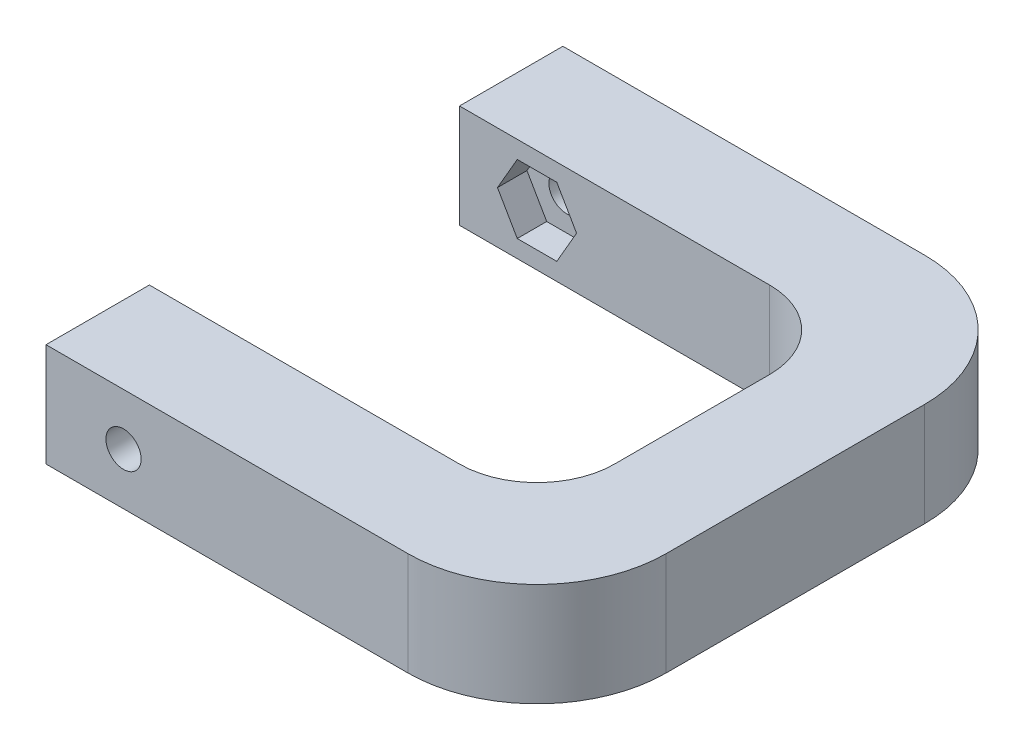
ISO-10303-21;
HEADER;
FILE_DESCRIPTION(('STEP AP214'),'2;1');
FILE_NAME('part.step','',(''),(''),'','','');
FILE_SCHEMA(('AUTOMOTIVE_DESIGN { 1 0 10303 214 1 1 1 1 }'));
ENDSEC;
DATA;
#1=APPLICATION_CONTEXT('core data for automotive mechanical design processes');
#2=APPLICATION_PROTOCOL_DEFINITION('international standard','automotive_design',2000,#1);
#3=PRODUCT_CONTEXT('',#1,'mechanical');
#4=PRODUCT('Part','Part','',(#3));
#5=PRODUCT_RELATED_PRODUCT_CATEGORY('part','',(#4));
#6=PRODUCT_DEFINITION_FORMATION('','',#4);
#7=PRODUCT_DEFINITION_CONTEXT('part definition',#1,'design');
#8=PRODUCT_DEFINITION('design','',#6,#7);
#9=PRODUCT_DEFINITION_SHAPE('','',#8);
#10=(LENGTH_UNIT() NAMED_UNIT(*) SI_UNIT(.MILLI.,.METRE.));
#11=(NAMED_UNIT(*) PLANE_ANGLE_UNIT() SI_UNIT($,.RADIAN.));
#12=(NAMED_UNIT(*) SI_UNIT($,.STERADIAN.) SOLID_ANGLE_UNIT());
#13=UNCERTAINTY_MEASURE_WITH_UNIT(LENGTH_MEASURE(1.E-05),#10,'distance_accuracy_value','');
#14=(GEOMETRIC_REPRESENTATION_CONTEXT(3) GLOBAL_UNCERTAINTY_ASSIGNED_CONTEXT((#13)) GLOBAL_UNIT_ASSIGNED_CONTEXT((#10,
#11,#12)) REPRESENTATION_CONTEXT('',''));
#15=CARTESIAN_POINT('',(0.,0.,0.));
#16=DIRECTION('',(0.,0.,1.));
#17=DIRECTION('',(1.,0.,0.));
#18=AXIS2_PLACEMENT_3D('',#15,#16,#17);
#19=CARTESIAN_POINT('',(-80.,10.,-100.));
#20=DIRECTION('',(0.,0.,1.));
#21=DIRECTION('',(1.,0.,0.));
#22=AXIS2_PLACEMENT_3D('',#19,#20,#21);
#23=CYLINDRICAL_SURFACE('',#22,3.4);
#24=CARTESIAN_POINT('',(-80.,10.,0.));
#25=DIRECTION('',(0.,0.,1.));
#26=DIRECTION('',(1.,0.,0.));
#27=AXIS2_PLACEMENT_3D('',#24,#25,#26);
#28=CIRCLE('',#27,3.4);
#29=CARTESIAN_POINT('',(-76.6,10.,0.));
#30=VERTEX_POINT('',#29);
#31=EDGE_CURVE('E308',#30,#30,#28,.T.);
#32=ORIENTED_EDGE('',*,*,#31,.T.);
#33=EDGE_LOOP('',(#32));
#34=FACE_BOUND('',#33,.T.);
#35=CARTESIAN_POINT('',(-80.,10.,-14.3));
#36=DIRECTION('',(0.,0.,-1.));
#37=DIRECTION('',(-1.,0.,0.));
#38=AXIS2_PLACEMENT_3D('',#35,#36,#37);
#39=CIRCLE('',#38,3.4);
#40=CARTESIAN_POINT('',(-83.4,10.,-14.3));
#41=VERTEX_POINT('',#40);
#42=EDGE_CURVE('E251',#41,#41,#39,.F.);
#43=ORIENTED_EDGE('',*,*,#42,.F.);
#44=EDGE_LOOP('',(#43));
#45=FACE_BOUND('',#44,.T.);
#46=ADVANCED_FACE('F35',(#34,#45),#23,.F.);
#47=CARTESIAN_POINT('',(-80.,10.,-100.));
#48=DIRECTION('',(0.,0.,1.));
#49=DIRECTION('',(1.,0.,0.));
#50=AXIS2_PLACEMENT_3D('',#47,#48,#49);
#51=CIRCLE('',#50,3.4);
#52=CARTESIAN_POINT('',(-76.6,10.,-100.));
#53=VERTEX_POINT('',#52);
#54=EDGE_CURVE('E311',#53,#53,#51,.T.);
#55=ORIENTED_EDGE('',*,*,#54,.F.);
#56=EDGE_LOOP('',(#55));
#57=FACE_BOUND('',#56,.T.);
#58=CARTESIAN_POINT('',(-80.,10.,-85.7));
#59=DIRECTION('',(0.,0.,1.));
#60=DIRECTION('',(1.,0.,0.));
#61=AXIS2_PLACEMENT_3D('',#58,#59,#60);
#62=CIRCLE('',#61,3.4);
#63=CARTESIAN_POINT('',(-76.6,10.,-85.7));
#64=VERTEX_POINT('',#63);
#65=EDGE_CURVE('E297',#64,#64,#62,.F.);
#66=ORIENTED_EDGE('',*,*,#65,.F.);
#67=EDGE_LOOP('',(#66));
#68=FACE_BOUND('',#67,.T.);
#69=ADVANCED_FACE('F453',(#57,#68),#23,.F.);
#70=CARTESIAN_POINT('',(-95.,20.,0.));
#71=DIRECTION('',(0.,0.,-1.));
#72=DIRECTION('',(-1.,0.,0.));
#73=AXIS2_PLACEMENT_3D('',#70,#71,#72);
#74=PLANE('',#73);
#75=ORIENTED_EDGE('',*,*,#31,.F.);
#76=EDGE_LOOP('',(#75));
#77=FACE_BOUND('',#76,.T.);
#78=DIRECTION('',(1.,0.,0.));
#79=VECTOR('',#78,1.);
#80=CARTESIAN_POINT('',(-95.,0.,0.));
#81=LINE('',#80,#79);
#82=CARTESIAN_POINT('',(-95.,0.,0.));
#83=VERTEX_POINT('',#82);
#84=CARTESIAN_POINT('',(-25.,0.,0.));
#85=VERTEX_POINT('',#84);
#86=EDGE_CURVE('E314',#83,#85,#81,.T.);
#87=ORIENTED_EDGE('',*,*,#86,.T.);
#88=DIRECTION('',(0.,-1.,0.));
#89=VECTOR('',#88,1.);
#90=CARTESIAN_POINT('',(-25.,20.,0.));
#91=LINE('',#90,#89);
#92=CARTESIAN_POINT('',(-25.,20.,0.));
#93=VERTEX_POINT('',#92);
#94=EDGE_CURVE('E58',#85,#93,#91,.F.);
#95=ORIENTED_EDGE('',*,*,#94,.T.);
#96=DIRECTION('',(1.,0.,0.));
#97=VECTOR('',#96,1.);
#98=CARTESIAN_POINT('',(-95.,20.,0.));
#99=LINE('',#98,#97);
#100=CARTESIAN_POINT('',(-95.,20.,0.));
#101=VERTEX_POINT('',#100);
#102=EDGE_CURVE('E315',#101,#93,#99,.T.);
#103=ORIENTED_EDGE('',*,*,#102,.F.);
#104=DIRECTION('',(0.,-1.,0.));
#105=VECTOR('',#104,1.);
#106=CARTESIAN_POINT('',(-95.,20.,0.));
#107=LINE('',#106,#105);
#108=EDGE_CURVE('E334',#101,#83,#107,.T.);
#109=ORIENTED_EDGE('',*,*,#108,.T.);
#110=EDGE_LOOP('',(#87,#95,#103,#109));
#111=FACE_BOUND('',#110,.T.);
#112=ADVANCED_FACE('F409',(#77,#111),#74,.F.);
#113=CARTESIAN_POINT('',(0.,20.,0.));
#114=DIRECTION('',(-1.,0.,0.));
#115=DIRECTION('',(0.,0.,1.));
#116=AXIS2_PLACEMENT_3D('',#113,#114,#115);
#117=PLANE('',#116);
#118=DIRECTION('',(0.,0.,-1.));
#119=VECTOR('',#118,1.);
#120=CARTESIAN_POINT('',(0.,20.,0.));
#121=LINE('',#120,#119);
#122=CARTESIAN_POINT('',(0.,20.,-25.));
#123=VERTEX_POINT('',#122);
#124=CARTESIAN_POINT('',(0.,20.,-75.));
#125=VERTEX_POINT('',#124);
#126=EDGE_CURVE('E317',#123,#125,#121,.T.);
#127=ORIENTED_EDGE('',*,*,#126,.F.);
#128=DIRECTION('',(0.,-1.,0.));
#129=VECTOR('',#128,1.);
#130=CARTESIAN_POINT('',(0.,20.,-25.));
#131=LINE('',#130,#129);
#132=CARTESIAN_POINT('',(0.,0.,-25.));
#133=VERTEX_POINT('',#132);
#134=EDGE_CURVE('E387',#123,#133,#131,.T.);
#135=ORIENTED_EDGE('',*,*,#134,.T.);
#136=DIRECTION('',(0.,0.,-1.));
#137=VECTOR('',#136,1.);
#138=CARTESIAN_POINT('',(0.,0.,0.));
#139=LINE('',#138,#137);
#140=CARTESIAN_POINT('',(0.,0.,-75.));
#141=VERTEX_POINT('',#140);
#142=EDGE_CURVE('E336',#133,#141,#139,.T.);
#143=ORIENTED_EDGE('',*,*,#142,.T.);
#144=DIRECTION('',(0.,-1.,0.));
#145=VECTOR('',#144,1.);
#146=CARTESIAN_POINT('',(0.,20.,-75.));
#147=LINE('',#146,#145);
#148=EDGE_CURVE('E385',#141,#125,#147,.F.);
#149=ORIENTED_EDGE('',*,*,#148,.T.);
#150=EDGE_LOOP('',(#127,#135,#143,#149));
#151=FACE_BOUND('',#150,.T.);
#152=ADVANCED_FACE('F401',(#151),#117,.F.);
#153=CARTESIAN_POINT('',(-95.,20.,-100.));
#154=DIRECTION('',(0.,0.,1.));
#155=DIRECTION('',(1.,0.,0.));
#156=AXIS2_PLACEMENT_3D('',#153,#154,#155);
#157=PLANE('',#156);
#158=ORIENTED_EDGE('',*,*,#54,.T.);
#159=EDGE_LOOP('',(#158));
#160=FACE_BOUND('',#159,.T.);
#161=DIRECTION('',(-1.,0.,0.));
#162=VECTOR('',#161,1.);
#163=CARTESIAN_POINT('',(-95.,20.,-100.));
#164=LINE('',#163,#162);
#165=CARTESIAN_POINT('',(-25.,20.,-100.));
#166=VERTEX_POINT('',#165);
#167=CARTESIAN_POINT('',(-95.,20.,-100.));
#168=VERTEX_POINT('',#167);
#169=EDGE_CURVE('E320',#166,#168,#164,.T.);
#170=ORIENTED_EDGE('',*,*,#169,.F.);
#171=DIRECTION('',(0.,-1.,0.));
#172=VECTOR('',#171,1.);
#173=CARTESIAN_POINT('',(-25.,20.,-100.));
#174=LINE('',#173,#172);
#175=CARTESIAN_POINT('',(-25.,0.,-100.));
#176=VERTEX_POINT('',#175);
#177=EDGE_CURVE('E11',#166,#176,#174,.T.);
#178=ORIENTED_EDGE('',*,*,#177,.T.);
#179=DIRECTION('',(-1.,0.,0.));
#180=VECTOR('',#179,1.);
#181=CARTESIAN_POINT('',(-95.,0.,-100.));
#182=LINE('',#181,#180);
#183=CARTESIAN_POINT('',(-95.,0.,-100.));
#184=VERTEX_POINT('',#183);
#185=EDGE_CURVE('E339',#176,#184,#182,.T.);
#186=ORIENTED_EDGE('',*,*,#185,.T.);
#187=DIRECTION('',(0.,-1.,0.));
#188=VECTOR('',#187,1.);
#189=CARTESIAN_POINT('',(-95.,20.,-100.));
#190=LINE('',#189,#188);
#191=EDGE_CURVE('E360',#168,#184,#190,.T.);
#192=ORIENTED_EDGE('',*,*,#191,.F.);
#193=EDGE_LOOP('',(#170,#178,#186,#192));
#194=FACE_BOUND('',#193,.T.);
#195=ADVANCED_FACE('F445',(#160,#194),#157,.F.);
#196=CARTESIAN_POINT('',(-95.,20.,-80.));
#197=DIRECTION('',(1.,0.,0.));
#198=DIRECTION('',(0.,0.,-1.));
#199=AXIS2_PLACEMENT_3D('',#196,#197,#198);
#200=PLANE('',#199);
#201=DIRECTION('',(0.,0.,1.));
#202=VECTOR('',#201,1.);
#203=CARTESIAN_POINT('',(-95.,0.,-80.));
#204=LINE('',#203,#202);
#205=CARTESIAN_POINT('',(-95.,0.,-80.));
#206=VERTEX_POINT('',#205);
#207=EDGE_CURVE('E341',#184,#206,#204,.T.);
#208=ORIENTED_EDGE('',*,*,#207,.T.);
#209=DIRECTION('',(0.,-1.,0.));
#210=VECTOR('',#209,1.);
#211=CARTESIAN_POINT('',(-95.,20.,-80.));
#212=LINE('',#211,#210);
#213=CARTESIAN_POINT('',(-95.,20.,-80.));
#214=VERTEX_POINT('',#213);
#215=EDGE_CURVE('E357',#214,#206,#212,.T.);
#216=ORIENTED_EDGE('',*,*,#215,.F.);
#217=DIRECTION('',(0.,0.,1.));
#218=VECTOR('',#217,1.);
#219=CARTESIAN_POINT('',(-95.,20.,-80.));
#220=LINE('',#219,#218);
#221=EDGE_CURVE('E322',#168,#214,#220,.T.);
#222=ORIENTED_EDGE('',*,*,#221,.F.);
#223=ORIENTED_EDGE('',*,*,#191,.T.);
#224=EDGE_LOOP('',(#208,#216,#222,#223));
#225=FACE_BOUND('',#224,.T.);
#226=ADVANCED_FACE('F441',(#225),#200,.F.);
#227=CARTESIAN_POINT('',(-20.,20.,-80.));
#228=DIRECTION('',(0.,0.,-1.));
#229=DIRECTION('',(-1.,0.,0.));
#230=AXIS2_PLACEMENT_3D('',#227,#228,#229);
#231=PLANE('',#230);
#232=DIRECTION('',(0.5,0.866025403784439,0.));
#233=VECTOR('',#232,1.);
#234=CARTESIAN_POINT('',(-76.175,3.37490566104903,-80.));
#235=LINE('',#234,#233);
#236=CARTESIAN_POINT('',(-76.175,3.37490566104903,-80.));
#237=VERTEX_POINT('',#236);
#238=CARTESIAN_POINT('',(-72.35,10.,-80.));
#239=VERTEX_POINT('',#238);
#240=EDGE_CURVE('E281',#237,#239,#235,.T.);
#241=ORIENTED_EDGE('',*,*,#240,.F.);
#242=DIRECTION('',(1.,0.,0.));
#243=VECTOR('',#242,1.);
#244=CARTESIAN_POINT('',(-83.825,3.37490566104903,-80.));
#245=LINE('',#244,#243);
#246=CARTESIAN_POINT('',(-83.825,3.37490566104903,-80.));
#247=VERTEX_POINT('',#246);
#248=EDGE_CURVE('E279',#247,#237,#245,.T.);
#249=ORIENTED_EDGE('',*,*,#248,.F.);
#250=DIRECTION('',(0.5,-0.866025403784439,0.));
#251=VECTOR('',#250,1.);
#252=CARTESIAN_POINT('',(-87.65,10.,-80.));
#253=LINE('',#252,#251);
#254=CARTESIAN_POINT('',(-87.65,10.,-80.));
#255=VERTEX_POINT('',#254);
#256=EDGE_CURVE('E263',#255,#247,#253,.T.);
#257=ORIENTED_EDGE('',*,*,#256,.F.);
#258=DIRECTION('',(-0.500000000000001,-0.866025403784438,0.));
#259=VECTOR('',#258,1.);
#260=CARTESIAN_POINT('',(-83.825,16.625094338951,-80.));
#261=LINE('',#260,#259);
#262=CARTESIAN_POINT('',(-83.825,16.625094338951,-80.));
#263=VERTEX_POINT('',#262);
#264=EDGE_CURVE('E290',#263,#255,#261,.T.);
#265=ORIENTED_EDGE('',*,*,#264,.F.);
#266=DIRECTION('',(-1.,0.,0.));
#267=VECTOR('',#266,1.);
#268=CARTESIAN_POINT('',(-76.175,16.625094338951,-80.));
#269=LINE('',#268,#267);
#270=CARTESIAN_POINT('',(-76.175,16.625094338951,-80.));
#271=VERTEX_POINT('',#270);
#272=EDGE_CURVE('E287',#271,#263,#269,.T.);
#273=ORIENTED_EDGE('',*,*,#272,.F.);
#274=DIRECTION('',(-0.5,0.866025403784439,0.));
#275=VECTOR('',#274,1.);
#276=CARTESIAN_POINT('',(-72.35,10.,-80.));
#277=LINE('',#276,#275);
#278=EDGE_CURVE('E284',#239,#271,#277,.T.);
#279=ORIENTED_EDGE('',*,*,#278,.F.);
#280=EDGE_LOOP('',(#241,#249,#257,#265,#273,#279));
#281=FACE_BOUND('',#280,.T.);
#282=DIRECTION('',(1.,0.,0.));
#283=VECTOR('',#282,1.);
#284=CARTESIAN_POINT('',(-20.,0.,-80.));
#285=LINE('',#284,#283);
#286=CARTESIAN_POINT('',(-35.,0.,-80.));
#287=VERTEX_POINT('',#286);
#288=EDGE_CURVE('E343',#206,#287,#285,.T.);
#289=ORIENTED_EDGE('',*,*,#288,.T.);
#290=DIRECTION('',(0.,-1.,0.));
#291=VECTOR('',#290,1.);
#292=CARTESIAN_POINT('',(-35.,20.,-80.));
#293=LINE('',#292,#291);
#294=CARTESIAN_POINT('',(-35.,20.,-80.));
#295=VERTEX_POINT('',#294);
#296=EDGE_CURVE('E375',#287,#295,#293,.F.);
#297=ORIENTED_EDGE('',*,*,#296,.T.);
#298=DIRECTION('',(1.,0.,0.));
#299=VECTOR('',#298,1.);
#300=CARTESIAN_POINT('',(-20.,20.,-80.));
#301=LINE('',#300,#299);
#302=EDGE_CURVE('E324',#214,#295,#301,.T.);
#303=ORIENTED_EDGE('',*,*,#302,.F.);
#304=ORIENTED_EDGE('',*,*,#215,.T.);
#305=EDGE_LOOP('',(#289,#297,#303,#304));
#306=FACE_BOUND('',#305,.T.);
#307=ADVANCED_FACE('F437',(#281,#306),#231,.F.);
#308=CARTESIAN_POINT('',(-20.,20.,-20.));
#309=DIRECTION('',(1.,0.,0.));
#310=DIRECTION('',(0.,0.,-1.));
#311=AXIS2_PLACEMENT_3D('',#308,#309,#310);
#312=PLANE('',#311);
#313=DIRECTION('',(0.,0.,1.));
#314=VECTOR('',#313,1.);
#315=CARTESIAN_POINT('',(-20.,0.,-20.));
#316=LINE('',#315,#314);
#317=CARTESIAN_POINT('',(-20.,0.,-65.));
#318=VERTEX_POINT('',#317);
#319=CARTESIAN_POINT('',(-20.,0.,-35.));
#320=VERTEX_POINT('',#319);
#321=EDGE_CURVE('E346',#318,#320,#316,.T.);
#322=ORIENTED_EDGE('',*,*,#321,.T.);
#323=DIRECTION('',(0.,-1.,0.));
#324=VECTOR('',#323,1.);
#325=CARTESIAN_POINT('',(-20.,20.,-35.));
#326=LINE('',#325,#324);
#327=CARTESIAN_POINT('',(-20.,20.,-35.));
#328=VERTEX_POINT('',#327);
#329=EDGE_CURVE('E373',#320,#328,#326,.F.);
#330=ORIENTED_EDGE('',*,*,#329,.T.);
#331=DIRECTION('',(0.,0.,1.));
#332=VECTOR('',#331,1.);
#333=CARTESIAN_POINT('',(-20.,20.,-20.));
#334=LINE('',#333,#332);
#335=CARTESIAN_POINT('',(-20.,20.,-65.));
#336=VERTEX_POINT('',#335);
#337=EDGE_CURVE('E327',#336,#328,#334,.T.);
#338=ORIENTED_EDGE('',*,*,#337,.F.);
#339=DIRECTION('',(0.,-1.,0.));
#340=VECTOR('',#339,1.);
#341=CARTESIAN_POINT('',(-20.,0.,-65.));
#342=LINE('',#341,#340);
#343=EDGE_CURVE('E370',#336,#318,#342,.T.);
#344=ORIENTED_EDGE('',*,*,#343,.T.);
#345=EDGE_LOOP('',(#322,#330,#338,#344));
#346=FACE_BOUND('',#345,.T.);
#347=ADVANCED_FACE('F427',(#346),#312,.F.);
#348=CARTESIAN_POINT('',(-95.,20.,-20.));
#349=DIRECTION('',(0.,0.,1.));
#350=DIRECTION('',(1.,0.,0.));
#351=AXIS2_PLACEMENT_3D('',#348,#349,#350);
#352=PLANE('',#351);
#353=DIRECTION('',(1.,0.,0.));
#354=VECTOR('',#353,1.);
#355=CARTESIAN_POINT('',(-95.,16.625094338951,-20.));
#356=LINE('',#355,#354);
#357=CARTESIAN_POINT('',(-83.825,16.625094338951,-20.));
#358=VERTEX_POINT('',#357);
#359=CARTESIAN_POINT('',(-76.175,16.625094338951,-20.));
#360=VERTEX_POINT('',#359);
#361=EDGE_CURVE('E239',#358,#360,#356,.T.);
#362=ORIENTED_EDGE('',*,*,#361,.F.);
#363=DIRECTION('',(0.500000000000001,0.866025403784438,0.));
#364=VECTOR('',#363,1.);
#365=CARTESIAN_POINT('',(-85.1573729810778,14.3173566410922,-20.));
#366=LINE('',#365,#364);
#367=CARTESIAN_POINT('',(-87.65,10.,-20.));
#368=VERTEX_POINT('',#367);
#369=EDGE_CURVE('E206',#368,#358,#366,.T.);
#370=ORIENTED_EDGE('',*,*,#369,.F.);
#371=DIRECTION('',(-0.5,0.866025403784439,0.));
#372=VECTOR('',#371,1.);
#373=CARTESIAN_POINT('',(-93.8176270189222,20.6826433589078,-20.));
#374=LINE('',#373,#372);
#375=CARTESIAN_POINT('',(-83.825,3.37490566104903,-20.));
#376=VERTEX_POINT('',#375);
#377=EDGE_CURVE('E225',#376,#368,#374,.T.);
#378=ORIENTED_EDGE('',*,*,#377,.F.);
#379=DIRECTION('',(-1.,0.,0.));
#380=VECTOR('',#379,1.);
#381=CARTESIAN_POINT('',(-95.,3.37490566104903,-20.));
#382=LINE('',#381,#380);
#383=CARTESIAN_POINT('',(-76.175,3.37490566104903,-20.));
#384=VERTEX_POINT('',#383);
#385=EDGE_CURVE('E228',#384,#376,#382,.T.);
#386=ORIENTED_EDGE('',*,*,#385,.F.);
#387=DIRECTION('',(-0.5,-0.866025403784439,0.));
#388=VECTOR('',#387,1.);
#389=CARTESIAN_POINT('',(-73.6823729810778,7.69226230214124,-20.));
#390=LINE('',#389,#388);
#391=CARTESIAN_POINT('',(-72.35,10.,-20.));
#392=VERTEX_POINT('',#391);
#393=EDGE_CURVE('E244',#392,#384,#390,.T.);
#394=ORIENTED_EDGE('',*,*,#393,.F.);
#395=DIRECTION('',(0.5,-0.866025403784439,0.));
#396=VECTOR('',#395,1.);
#397=CARTESIAN_POINT('',(-82.3426270189222,27.3077376978588,-20.));
#398=LINE('',#397,#396);
#399=EDGE_CURVE('E241',#360,#392,#398,.T.);
#400=ORIENTED_EDGE('',*,*,#399,.F.);
#401=EDGE_LOOP('',(#362,#370,#378,#386,#394,#400));
#402=FACE_BOUND('',#401,.T.);
#403=DIRECTION('',(-1.,0.,0.));
#404=VECTOR('',#403,1.);
#405=CARTESIAN_POINT('',(-95.,20.,-20.));
#406=LINE('',#405,#404);
#407=CARTESIAN_POINT('',(-35.,20.,-20.));
#408=VERTEX_POINT('',#407);
#409=CARTESIAN_POINT('',(-95.,20.,-20.));
#410=VERTEX_POINT('',#409);
#411=EDGE_CURVE('E330',#408,#410,#406,.T.);
#412=ORIENTED_EDGE('',*,*,#411,.F.);
#413=DIRECTION('',(0.,-1.,0.));
#414=VECTOR('',#413,1.);
#415=CARTESIAN_POINT('',(-35.,0.,-20.));
#416=LINE('',#415,#414);
#417=CARTESIAN_POINT('',(-35.,0.,-20.));
#418=VERTEX_POINT('',#417);
#419=EDGE_CURVE('E363',#408,#418,#416,.T.);
#420=ORIENTED_EDGE('',*,*,#419,.T.);
#421=DIRECTION('',(-1.,0.,0.));
#422=VECTOR('',#421,1.);
#423=CARTESIAN_POINT('',(-95.,0.,-20.));
#424=LINE('',#423,#422);
#425=CARTESIAN_POINT('',(-95.,0.,-20.));
#426=VERTEX_POINT('',#425);
#427=EDGE_CURVE('E349',#418,#426,#424,.T.);
#428=ORIENTED_EDGE('',*,*,#427,.T.);
#429=DIRECTION('',(0.,-1.,0.));
#430=VECTOR('',#429,1.);
#431=CARTESIAN_POINT('',(-95.,20.,-20.));
#432=LINE('',#431,#430);
#433=EDGE_CURVE('E354',#410,#426,#432,.T.);
#434=ORIENTED_EDGE('',*,*,#433,.F.);
#435=EDGE_LOOP('',(#412,#420,#428,#434));
#436=FACE_BOUND('',#435,.T.);
#437=ADVANCED_FACE('F419',(#402,#436),#352,.F.);
#438=CARTESIAN_POINT('',(-95.,20.,-20.));
#439=DIRECTION('',(1.,0.,0.));
#440=DIRECTION('',(0.,0.,-1.));
#441=AXIS2_PLACEMENT_3D('',#438,#439,#440);
#442=PLANE('',#441);
#443=DIRECTION('',(0.,0.,1.));
#444=VECTOR('',#443,1.);
#445=CARTESIAN_POINT('',(-95.,0.,-20.));
#446=LINE('',#445,#444);
#447=EDGE_CURVE('E318',#426,#83,#446,.T.);
#448=ORIENTED_EDGE('',*,*,#447,.T.);
#449=ORIENTED_EDGE('',*,*,#108,.F.);
#450=DIRECTION('',(0.,0.,1.));
#451=VECTOR('',#450,1.);
#452=CARTESIAN_POINT('',(-95.,20.,-20.));
#453=LINE('',#452,#451);
#454=EDGE_CURVE('E332',#410,#101,#453,.T.);
#455=ORIENTED_EDGE('',*,*,#454,.F.);
#456=ORIENTED_EDGE('',*,*,#433,.T.);
#457=EDGE_LOOP('',(#448,#449,#455,#456));
#458=FACE_BOUND('',#457,.T.);
#459=ADVANCED_FACE('F413',(#458),#442,.F.);
#460=CARTESIAN_POINT('',(0.,20.,0.));
#461=DIRECTION('',(0.,1.,0.));
#462=DIRECTION('',(0.,0.,1.));
#463=AXIS2_PLACEMENT_3D('',#460,#461,#462);
#464=PLANE('',#463);
#465=ORIENTED_EDGE('',*,*,#102,.T.);
#466=CARTESIAN_POINT('',(-25.,20.,-25.));
#467=DIRECTION('',(0.,1.,0.));
#468=DIRECTION('',(0.,0.,1.));
#469=AXIS2_PLACEMENT_3D('',#466,#467,#468);
#470=CIRCLE('',#469,25.);
#471=EDGE_CURVE('E43',#93,#123,#470,.T.);
#472=ORIENTED_EDGE('',*,*,#471,.T.);
#473=ORIENTED_EDGE('',*,*,#126,.T.);
#474=CARTESIAN_POINT('',(-25.,20.,-75.));
#475=DIRECTION('',(0.,1.,0.));
#476=DIRECTION('',(0.,0.,1.));
#477=AXIS2_PLACEMENT_3D('',#474,#475,#476);
#478=CIRCLE('',#477,25.);
#479=EDGE_CURVE('E50',#125,#166,#478,.T.);
#480=ORIENTED_EDGE('',*,*,#479,.T.);
#481=ORIENTED_EDGE('',*,*,#169,.T.);
#482=ORIENTED_EDGE('',*,*,#221,.T.);
#483=ORIENTED_EDGE('',*,*,#302,.T.);
#484=CARTESIAN_POINT('',(-35.,20.,-65.));
#485=DIRECTION('',(0.,1.,0.));
#486=DIRECTION('',(0.,0.,1.));
#487=AXIS2_PLACEMENT_3D('',#484,#485,#486);
#488=CIRCLE('',#487,15.);
#489=EDGE_CURVE('E383',#295,#336,#488,.F.);
#490=ORIENTED_EDGE('',*,*,#489,.T.);
#491=ORIENTED_EDGE('',*,*,#337,.T.);
#492=CARTESIAN_POINT('',(-35.,20.,-35.));
#493=DIRECTION('',(0.,1.,0.));
#494=DIRECTION('',(0.,0.,1.));
#495=AXIS2_PLACEMENT_3D('',#492,#493,#494);
#496=CIRCLE('',#495,15.);
#497=EDGE_CURVE('E379',#328,#408,#496,.F.);
#498=ORIENTED_EDGE('',*,*,#497,.T.);
#499=ORIENTED_EDGE('',*,*,#411,.T.);
#500=ORIENTED_EDGE('',*,*,#454,.T.);
#501=EDGE_LOOP('',(#465,#472,#473,#480,#481,#482,#483,#490,#491,#498,#499,#500));
#502=FACE_BOUND('',#501,.T.);
#503=ADVANCED_FACE('F397',(#502),#464,.T.);
#504=CARTESIAN_POINT('',(0.,0.,0.));
#505=DIRECTION('',(0.,1.,0.));
#506=DIRECTION('',(0.,0.,1.));
#507=AXIS2_PLACEMENT_3D('',#504,#505,#506);
#508=PLANE('',#507);
#509=ORIENTED_EDGE('',*,*,#142,.F.);
#510=CARTESIAN_POINT('',(-25.,0.,-25.));
#511=DIRECTION('',(0.,1.,0.));
#512=DIRECTION('',(0.,0.,1.));
#513=AXIS2_PLACEMENT_3D('',#510,#511,#512);
#514=CIRCLE('',#513,25.);
#515=EDGE_CURVE('E392',#133,#85,#514,.F.);
#516=ORIENTED_EDGE('',*,*,#515,.T.);
#517=ORIENTED_EDGE('',*,*,#86,.F.);
#518=ORIENTED_EDGE('',*,*,#447,.F.);
#519=ORIENTED_EDGE('',*,*,#427,.F.);
#520=CARTESIAN_POINT('',(-35.,0.,-35.));
#521=DIRECTION('',(0.,1.,0.));
#522=DIRECTION('',(0.,0.,1.));
#523=AXIS2_PLACEMENT_3D('',#520,#521,#522);
#524=CIRCLE('',#523,15.);
#525=EDGE_CURVE('E377',#418,#320,#524,.T.);
#526=ORIENTED_EDGE('',*,*,#525,.T.);
#527=ORIENTED_EDGE('',*,*,#321,.F.);
#528=CARTESIAN_POINT('',(-35.,0.,-65.));
#529=DIRECTION('',(0.,1.,0.));
#530=DIRECTION('',(0.,0.,1.));
#531=AXIS2_PLACEMENT_3D('',#528,#529,#530);
#532=CIRCLE('',#531,15.);
#533=EDGE_CURVE('E381',#318,#287,#532,.T.);
#534=ORIENTED_EDGE('',*,*,#533,.T.);
#535=ORIENTED_EDGE('',*,*,#288,.F.);
#536=ORIENTED_EDGE('',*,*,#207,.F.);
#537=ORIENTED_EDGE('',*,*,#185,.F.);
#538=CARTESIAN_POINT('',(-25.,0.,-75.));
#539=DIRECTION('',(0.,1.,0.));
#540=DIRECTION('',(0.,0.,1.));
#541=AXIS2_PLACEMENT_3D('',#538,#539,#540);
#542=CIRCLE('',#541,25.);
#543=EDGE_CURVE('E390',#176,#141,#542,.F.);
#544=ORIENTED_EDGE('',*,*,#543,.T.);
#545=EDGE_LOOP('',(#509,#516,#517,#518,#519,#526,#527,#534,#535,#536,#537,#544));
#546=FACE_BOUND('',#545,.T.);
#547=ADVANCED_FACE('F407',(#546),#508,.F.);
#548=CARTESIAN_POINT('',(0.,0.,-85.7));
#549=DIRECTION('',(0.,0.,1.));
#550=DIRECTION('',(1.,0.,0.));
#551=AXIS2_PLACEMENT_3D('',#548,#549,#550);
#552=PLANE('',#551);
#553=DIRECTION('',(1.,0.,0.));
#554=VECTOR('',#553,1.);
#555=CARTESIAN_POINT('',(-83.825,3.37490566104903,-85.7));
#556=LINE('',#555,#554);
#557=CARTESIAN_POINT('',(-83.825,3.37490566104903,-85.7));
#558=VERTEX_POINT('',#557);
#559=CARTESIAN_POINT('',(-76.175,3.37490566104903,-85.7));
#560=VERTEX_POINT('',#559);
#561=EDGE_CURVE('E259',#558,#560,#556,.T.);
#562=ORIENTED_EDGE('',*,*,#561,.T.);
#563=DIRECTION('',(0.5,0.866025403784439,0.));
#564=VECTOR('',#563,1.);
#565=CARTESIAN_POINT('',(-76.175,3.37490566104903,-85.7));
#566=LINE('',#565,#564);
#567=CARTESIAN_POINT('',(-72.35,10.,-85.7));
#568=VERTEX_POINT('',#567);
#569=EDGE_CURVE('E262',#560,#568,#566,.T.);
#570=ORIENTED_EDGE('',*,*,#569,.T.);
#571=DIRECTION('',(-0.5,0.866025403784439,0.));
#572=VECTOR('',#571,1.);
#573=CARTESIAN_POINT('',(-72.35,10.,-85.7));
#574=LINE('',#573,#572);
#575=CARTESIAN_POINT('',(-76.175,16.625094338951,-85.7));
#576=VERTEX_POINT('',#575);
#577=EDGE_CURVE('E266',#568,#576,#574,.T.);
#578=ORIENTED_EDGE('',*,*,#577,.T.);
#579=DIRECTION('',(-1.,0.,0.));
#580=VECTOR('',#579,1.);
#581=CARTESIAN_POINT('',(-76.175,16.625094338951,-85.7));
#582=LINE('',#581,#580);
#583=CARTESIAN_POINT('',(-83.825,16.625094338951,-85.7));
#584=VERTEX_POINT('',#583);
#585=EDGE_CURVE('E269',#576,#584,#582,.T.);
#586=ORIENTED_EDGE('',*,*,#585,.T.);
#587=DIRECTION('',(-0.500000000000001,-0.866025403784438,0.));
#588=VECTOR('',#587,1.);
#589=CARTESIAN_POINT('',(-83.825,16.625094338951,-85.7));
#590=LINE('',#589,#588);
#591=CARTESIAN_POINT('',(-87.65,10.,-85.7));
#592=VERTEX_POINT('',#591);
#593=EDGE_CURVE('E272',#584,#592,#590,.T.);
#594=ORIENTED_EDGE('',*,*,#593,.T.);
#595=DIRECTION('',(0.5,-0.866025403784439,0.));
#596=VECTOR('',#595,1.);
#597=CARTESIAN_POINT('',(-87.65,10.,-85.7));
#598=LINE('',#597,#596);
#599=EDGE_CURVE('E275',#592,#558,#598,.T.);
#600=ORIENTED_EDGE('',*,*,#599,.T.);
#601=EDGE_LOOP('',(#562,#570,#578,#586,#594,#600));
#602=FACE_BOUND('',#601,.T.);
#603=ORIENTED_EDGE('',*,*,#65,.T.);
#604=EDGE_LOOP('',(#603));
#605=FACE_BOUND('',#604,.T.);
#606=ADVANCED_FACE('F469',(#602,#605),#552,.T.);
#607=CARTESIAN_POINT('',(-83.825,3.37490566104903,-85.7));
#608=DIRECTION('',(0.,-1.,0.));
#609=DIRECTION('',(1.,0.,0.));
#610=AXIS2_PLACEMENT_3D('',#607,#608,#609);
#611=PLANE('',#610);
#612=ORIENTED_EDGE('',*,*,#248,.T.);
#613=DIRECTION('',(0.,0.,1.));
#614=VECTOR('',#613,1.);
#615=CARTESIAN_POINT('',(-76.175,3.37490566104903,-85.7));
#616=LINE('',#615,#614);
#617=EDGE_CURVE('E278',#560,#237,#616,.T.);
#618=ORIENTED_EDGE('',*,*,#617,.F.);
#619=ORIENTED_EDGE('',*,*,#561,.F.);
#620=DIRECTION('',(0.,0.,1.));
#621=VECTOR('',#620,1.);
#622=CARTESIAN_POINT('',(-83.825,3.37490566104903,-85.7));
#623=LINE('',#622,#621);
#624=EDGE_CURVE('E295',#558,#247,#623,.T.);
#625=ORIENTED_EDGE('',*,*,#624,.T.);
#626=EDGE_LOOP('',(#612,#618,#619,#625));
#627=FACE_BOUND('',#626,.T.);
#628=ADVANCED_FACE('F463',(#627),#611,.F.);
#629=CARTESIAN_POINT('',(-87.65,10.,-85.7));
#630=DIRECTION('',(-0.866025403784439,-0.5,0.));
#631=DIRECTION('',(0.5,-0.866025403784439,0.));
#632=AXIS2_PLACEMENT_3D('',#629,#630,#631);
#633=PLANE('',#632);
#634=ORIENTED_EDGE('',*,*,#256,.T.);
#635=ORIENTED_EDGE('',*,*,#624,.F.);
#636=ORIENTED_EDGE('',*,*,#599,.F.);
#637=DIRECTION('',(0.,0.,1.));
#638=VECTOR('',#637,1.);
#639=CARTESIAN_POINT('',(-87.65,10.,-85.7));
#640=LINE('',#639,#638);
#641=EDGE_CURVE('E298',#592,#255,#640,.T.);
#642=ORIENTED_EDGE('',*,*,#641,.T.);
#643=EDGE_LOOP('',(#634,#635,#636,#642));
#644=FACE_BOUND('',#643,.T.);
#645=ADVANCED_FACE('F565',(#644),#633,.F.);
#646=CARTESIAN_POINT('',(-83.825,16.625094338951,-85.7));
#647=DIRECTION('',(-0.866025403784438,0.500000000000001,0.));
#648=DIRECTION('',(-0.500000000000001,-0.866025403784438,0.));
#649=AXIS2_PLACEMENT_3D('',#646,#647,#648);
#650=PLANE('',#649);
#651=ORIENTED_EDGE('',*,*,#264,.T.);
#652=ORIENTED_EDGE('',*,*,#641,.F.);
#653=ORIENTED_EDGE('',*,*,#593,.F.);
#654=DIRECTION('',(0.,0.,1.));
#655=VECTOR('',#654,1.);
#656=CARTESIAN_POINT('',(-83.825,16.625094338951,-85.7));
#657=LINE('',#656,#655);
#658=EDGE_CURVE('E300',#584,#263,#657,.T.);
#659=ORIENTED_EDGE('',*,*,#658,.T.);
#660=EDGE_LOOP('',(#651,#652,#653,#659));
#661=FACE_BOUND('',#660,.T.);
#662=ADVANCED_FACE('F574',(#661),#650,.F.);
#663=CARTESIAN_POINT('',(-76.175,16.625094338951,-85.7));
#664=DIRECTION('',(0.,1.,0.));
#665=DIRECTION('',(0.,0.,1.));
#666=AXIS2_PLACEMENT_3D('',#663,#664,#665);
#667=PLANE('',#666);
#668=ORIENTED_EDGE('',*,*,#272,.T.);
#669=ORIENTED_EDGE('',*,*,#658,.F.);
#670=ORIENTED_EDGE('',*,*,#585,.F.);
#671=DIRECTION('',(0.,0.,1.));
#672=VECTOR('',#671,1.);
#673=CARTESIAN_POINT('',(-76.175,16.625094338951,-85.7));
#674=LINE('',#673,#672);
#675=EDGE_CURVE('E302',#576,#271,#674,.T.);
#676=ORIENTED_EDGE('',*,*,#675,.T.);
#677=EDGE_LOOP('',(#668,#669,#670,#676));
#678=FACE_BOUND('',#677,.T.);
#679=ADVANCED_FACE('F584',(#678),#667,.F.);
#680=CARTESIAN_POINT('',(-72.35,10.,-85.7));
#681=DIRECTION('',(0.866025403784439,0.5,0.));
#682=DIRECTION('',(-0.5,0.866025403784439,0.));
#683=AXIS2_PLACEMENT_3D('',#680,#681,#682);
#684=PLANE('',#683);
#685=ORIENTED_EDGE('',*,*,#278,.T.);
#686=ORIENTED_EDGE('',*,*,#675,.F.);
#687=ORIENTED_EDGE('',*,*,#577,.F.);
#688=DIRECTION('',(0.,0.,1.));
#689=VECTOR('',#688,1.);
#690=CARTESIAN_POINT('',(-72.35,10.,-85.7));
#691=LINE('',#690,#689);
#692=EDGE_CURVE('E304',#568,#239,#691,.T.);
#693=ORIENTED_EDGE('',*,*,#692,.T.);
#694=EDGE_LOOP('',(#685,#686,#687,#693));
#695=FACE_BOUND('',#694,.T.);
#696=ADVANCED_FACE('F594',(#695),#684,.F.);
#697=CARTESIAN_POINT('',(-76.175,3.37490566104903,-85.7));
#698=DIRECTION('',(0.866025403784439,-0.5,0.));
#699=DIRECTION('',(0.5,0.866025403784439,0.));
#700=AXIS2_PLACEMENT_3D('',#697,#698,#699);
#701=PLANE('',#700);
#702=ORIENTED_EDGE('',*,*,#240,.T.);
#703=ORIENTED_EDGE('',*,*,#692,.F.);
#704=ORIENTED_EDGE('',*,*,#569,.F.);
#705=ORIENTED_EDGE('',*,*,#617,.T.);
#706=EDGE_LOOP('',(#702,#703,#704,#705));
#707=FACE_BOUND('',#706,.T.);
#708=ADVANCED_FACE('F604',(#707),#701,.F.);
#709=CARTESIAN_POINT('',(0.,0.,-14.3));
#710=DIRECTION('',(0.,0.,-1.));
#711=DIRECTION('',(-1.,0.,0.));
#712=AXIS2_PLACEMENT_3D('',#709,#710,#711);
#713=PLANE('',#712);
#714=DIRECTION('',(0.500000000000001,0.866025403784438,0.));
#715=VECTOR('',#714,1.);
#716=CARTESIAN_POINT('',(-85.1573729810778,14.3173566410922,-14.3));
#717=LINE('',#716,#715);
#718=CARTESIAN_POINT('',(-87.65,10.,-14.3));
#719=VERTEX_POINT('',#718);
#720=CARTESIAN_POINT('',(-83.825,16.625094338951,-14.3));
#721=VERTEX_POINT('',#720);
#722=EDGE_CURVE('E203',#719,#721,#717,.T.);
#723=ORIENTED_EDGE('',*,*,#722,.T.);
#724=DIRECTION('',(1.,0.,0.));
#725=VECTOR('',#724,1.);
#726=CARTESIAN_POINT('',(-95.,16.625094338951,-14.3));
#727=LINE('',#726,#725);
#728=CARTESIAN_POINT('',(-76.175,16.625094338951,-14.3));
#729=VERTEX_POINT('',#728);
#730=EDGE_CURVE('E214',#721,#729,#727,.T.);
#731=ORIENTED_EDGE('',*,*,#730,.T.);
#732=DIRECTION('',(0.5,-0.866025403784439,0.));
#733=VECTOR('',#732,1.);
#734=CARTESIAN_POINT('',(-82.3426270189222,27.3077376978588,-14.3));
#735=LINE('',#734,#733);
#736=CARTESIAN_POINT('',(-72.35,10.,-14.3));
#737=VERTEX_POINT('',#736);
#738=EDGE_CURVE('E219',#729,#737,#735,.T.);
#739=ORIENTED_EDGE('',*,*,#738,.T.);
#740=DIRECTION('',(-0.5,-0.866025403784439,0.));
#741=VECTOR('',#740,1.);
#742=CARTESIAN_POINT('',(-73.6823729810778,7.69226230214124,-14.3));
#743=LINE('',#742,#741);
#744=CARTESIAN_POINT('',(-76.175,3.37490566104903,-14.3));
#745=VERTEX_POINT('',#744);
#746=EDGE_CURVE('E232',#737,#745,#743,.T.);
#747=ORIENTED_EDGE('',*,*,#746,.T.);
#748=DIRECTION('',(-1.,0.,0.));
#749=VECTOR('',#748,1.);
#750=CARTESIAN_POINT('',(-95.,3.37490566104903,-14.3));
#751=LINE('',#750,#749);
#752=CARTESIAN_POINT('',(-83.825,3.37490566104903,-14.3));
#753=VERTEX_POINT('',#752);
#754=EDGE_CURVE('E235',#745,#753,#751,.T.);
#755=ORIENTED_EDGE('',*,*,#754,.T.);
#756=DIRECTION('',(-0.5,0.866025403784439,0.));
#757=VECTOR('',#756,1.);
#758=CARTESIAN_POINT('',(-93.8176270189222,20.6826433589078,-14.3));
#759=LINE('',#758,#757);
#760=EDGE_CURVE('E211',#753,#719,#759,.T.);
#761=ORIENTED_EDGE('',*,*,#760,.T.);
#762=EDGE_LOOP('',(#723,#731,#739,#747,#755,#761));
#763=FACE_BOUND('',#762,.T.);
#764=ORIENTED_EDGE('',*,*,#42,.T.);
#765=EDGE_LOOP('',(#764));
#766=FACE_BOUND('',#765,.T.);
#767=ADVANCED_FACE('F221',(#763,#766),#713,.T.);
#768=CARTESIAN_POINT('',(-85.1573729810778,14.3173566410922,-14.3));
#769=DIRECTION('',(-0.866025403784438,0.500000000000001,0.));
#770=DIRECTION('',(-0.500000000000001,-0.866025403784438,0.));
#771=AXIS2_PLACEMENT_3D('',#768,#769,#770);
#772=PLANE('',#771);
#773=ORIENTED_EDGE('',*,*,#369,.T.);
#774=DIRECTION('',(0.,0.,-1.));
#775=VECTOR('',#774,1.);
#776=CARTESIAN_POINT('',(-83.825,16.625094338951,-14.3));
#777=LINE('',#776,#775);
#778=EDGE_CURVE('E199',#721,#358,#777,.T.);
#779=ORIENTED_EDGE('',*,*,#778,.F.);
#780=ORIENTED_EDGE('',*,*,#722,.F.);
#781=DIRECTION('',(0.,0.,-1.));
#782=VECTOR('',#781,1.);
#783=CARTESIAN_POINT('',(-87.65,10.,-14.3));
#784=LINE('',#783,#782);
#785=EDGE_CURVE('E249',#719,#368,#784,.T.);
#786=ORIENTED_EDGE('',*,*,#785,.T.);
#787=EDGE_LOOP('',(#773,#779,#780,#786));
#788=FACE_BOUND('',#787,.T.);
#789=ADVANCED_FACE('F201',(#788),#772,.F.);
#790=CARTESIAN_POINT('',(-93.8176270189222,20.6826433589078,-14.3));
#791=DIRECTION('',(-0.866025403784439,-0.5,0.));
#792=DIRECTION('',(0.5,-0.866025403784439,0.));
#793=AXIS2_PLACEMENT_3D('',#790,#791,#792);
#794=PLANE('',#793);
#795=ORIENTED_EDGE('',*,*,#377,.T.);
#796=ORIENTED_EDGE('',*,*,#785,.F.);
#797=ORIENTED_EDGE('',*,*,#760,.F.);
#798=DIRECTION('',(0.,0.,-1.));
#799=VECTOR('',#798,1.);
#800=CARTESIAN_POINT('',(-83.825,3.37490566104903,-14.3));
#801=LINE('',#800,#799);
#802=EDGE_CURVE('E252',#753,#376,#801,.T.);
#803=ORIENTED_EDGE('',*,*,#802,.T.);
#804=EDGE_LOOP('',(#795,#796,#797,#803));
#805=FACE_BOUND('',#804,.T.);
#806=ADVANCED_FACE('F634',(#805),#794,.F.);
#807=CARTESIAN_POINT('',(-95.,3.37490566104903,-14.3));
#808=DIRECTION('',(0.,-1.,0.));
#809=DIRECTION('',(1.,0.,0.));
#810=AXIS2_PLACEMENT_3D('',#807,#808,#809);
#811=PLANE('',#810);
#812=ORIENTED_EDGE('',*,*,#385,.T.);
#813=ORIENTED_EDGE('',*,*,#802,.F.);
#814=ORIENTED_EDGE('',*,*,#754,.F.);
#815=DIRECTION('',(0.,0.,-1.));
#816=VECTOR('',#815,1.);
#817=CARTESIAN_POINT('',(-76.175,3.37490566104903,-14.3));
#818=LINE('',#817,#816);
#819=EDGE_CURVE('E254',#745,#384,#818,.T.);
#820=ORIENTED_EDGE('',*,*,#819,.T.);
#821=EDGE_LOOP('',(#812,#813,#814,#820));
#822=FACE_BOUND('',#821,.T.);
#823=ADVANCED_FACE('F643',(#822),#811,.F.);
#824=CARTESIAN_POINT('',(-73.6823729810778,7.69226230214124,-14.3));
#825=DIRECTION('',(0.866025403784439,-0.5,0.));
#826=DIRECTION('',(0.5,0.866025403784439,0.));
#827=AXIS2_PLACEMENT_3D('',#824,#825,#826);
#828=PLANE('',#827);
#829=ORIENTED_EDGE('',*,*,#393,.T.);
#830=ORIENTED_EDGE('',*,*,#819,.F.);
#831=ORIENTED_EDGE('',*,*,#746,.F.);
#832=DIRECTION('',(0.,0.,-1.));
#833=VECTOR('',#832,1.);
#834=CARTESIAN_POINT('',(-72.35,10.,-14.3));
#835=LINE('',#834,#833);
#836=EDGE_CURVE('E256',#737,#392,#835,.T.);
#837=ORIENTED_EDGE('',*,*,#836,.T.);
#838=EDGE_LOOP('',(#829,#830,#831,#837));
#839=FACE_BOUND('',#838,.T.);
#840=ADVANCED_FACE('F653',(#839),#828,.F.);
#841=CARTESIAN_POINT('',(-82.3426270189222,27.3077376978588,-14.3));
#842=DIRECTION('',(0.866025403784439,0.5,0.));
#843=DIRECTION('',(-0.5,0.866025403784439,0.));
#844=AXIS2_PLACEMENT_3D('',#841,#842,#843);
#845=PLANE('',#844);
#846=ORIENTED_EDGE('',*,*,#399,.T.);
#847=ORIENTED_EDGE('',*,*,#836,.F.);
#848=ORIENTED_EDGE('',*,*,#738,.F.);
#849=DIRECTION('',(0.,0.,-1.));
#850=VECTOR('',#849,1.);
#851=CARTESIAN_POINT('',(-76.175,16.625094338951,-14.3));
#852=LINE('',#851,#850);
#853=EDGE_CURVE('E210',#729,#360,#852,.T.);
#854=ORIENTED_EDGE('',*,*,#853,.T.);
#855=EDGE_LOOP('',(#846,#847,#848,#854));
#856=FACE_BOUND('',#855,.T.);
#857=ADVANCED_FACE('F663',(#856),#845,.F.);
#858=CARTESIAN_POINT('',(-95.,16.625094338951,-14.3));
#859=DIRECTION('',(0.,1.,0.));
#860=DIRECTION('',(0.,0.,1.));
#861=AXIS2_PLACEMENT_3D('',#858,#859,#860);
#862=PLANE('',#861);
#863=ORIENTED_EDGE('',*,*,#361,.T.);
#864=ORIENTED_EDGE('',*,*,#853,.F.);
#865=ORIENTED_EDGE('',*,*,#730,.F.);
#866=ORIENTED_EDGE('',*,*,#778,.T.);
#867=EDGE_LOOP('',(#863,#864,#865,#866));
#868=FACE_BOUND('',#867,.T.);
#869=ADVANCED_FACE('F215',(#868),#862,.F.);
#870=CARTESIAN_POINT('',(-35.,20.,-35.));
#871=DIRECTION('',(0.,1.,0.));
#872=DIRECTION('',(0.,0.,1.));
#873=AXIS2_PLACEMENT_3D('',#870,#871,#872);
#874=CYLINDRICAL_SURFACE('',#873,15.);
#875=ORIENTED_EDGE('',*,*,#497,.F.);
#876=ORIENTED_EDGE('',*,*,#329,.F.);
#877=ORIENTED_EDGE('',*,*,#525,.F.);
#878=ORIENTED_EDGE('',*,*,#419,.F.);
#879=EDGE_LOOP('',(#875,#876,#877,#878));
#880=FACE_BOUND('',#879,.T.);
#881=ADVANCED_FACE('F423',(#880),#874,.F.);
#882=CARTESIAN_POINT('',(-35.,20.,-65.));
#883=DIRECTION('',(0.,1.,0.));
#884=DIRECTION('',(0.,0.,1.));
#885=AXIS2_PLACEMENT_3D('',#882,#883,#884);
#886=CYLINDRICAL_SURFACE('',#885,15.);
#887=ORIENTED_EDGE('',*,*,#489,.F.);
#888=ORIENTED_EDGE('',*,*,#296,.F.);
#889=ORIENTED_EDGE('',*,*,#533,.F.);
#890=ORIENTED_EDGE('',*,*,#343,.F.);
#891=EDGE_LOOP('',(#887,#888,#889,#890));
#892=FACE_BOUND('',#891,.T.);
#893=ADVANCED_FACE('F433',(#892),#886,.F.);
#894=CARTESIAN_POINT('',(-25.,20.,-25.));
#895=DIRECTION('',(0.,-1.,0.));
#896=DIRECTION('',(0.,0.,-1.));
#897=AXIS2_PLACEMENT_3D('',#894,#895,#896);
#898=CYLINDRICAL_SURFACE('',#897,25.);
#899=ORIENTED_EDGE('',*,*,#471,.F.);
#900=ORIENTED_EDGE('',*,*,#94,.F.);
#901=ORIENTED_EDGE('',*,*,#515,.F.);
#902=ORIENTED_EDGE('',*,*,#134,.F.);
#903=EDGE_LOOP('',(#899,#900,#901,#902));
#904=FACE_BOUND('',#903,.T.);
#905=ADVANCED_FACE('F404',(#904),#898,.T.);
#906=CARTESIAN_POINT('',(-25.,20.,-75.));
#907=DIRECTION('',(0.,-1.,0.));
#908=DIRECTION('',(0.,0.,-1.));
#909=AXIS2_PLACEMENT_3D('',#906,#907,#908);
#910=CYLINDRICAL_SURFACE('',#909,25.);
#911=ORIENTED_EDGE('',*,*,#479,.F.);
#912=ORIENTED_EDGE('',*,*,#148,.F.);
#913=ORIENTED_EDGE('',*,*,#543,.F.);
#914=ORIENTED_EDGE('',*,*,#177,.F.);
#915=EDGE_LOOP('',(#911,#912,#913,#914));
#916=FACE_BOUND('',#915,.T.);
#917=ADVANCED_FACE('F37',(#916),#910,.T.);
#918=CLOSED_SHELL('',(#46,#69,#112,#152,#195,#226,#307,#347,#437,#459,#503,#547,#606,#628,#645,
#662,#679,#696,#708,#767,#789,#806,#823,#840,#857,#869,#881,#893,#905,#917));
#919=MANIFOLD_SOLID_BREP('B2',#918);
#920=ADVANCED_BREP_SHAPE_REPRESENTATION('',(#18,#919),#14);
#921=SHAPE_DEFINITION_REPRESENTATION(#9,#920);
ENDSEC;
END-ISO-10303-21;
